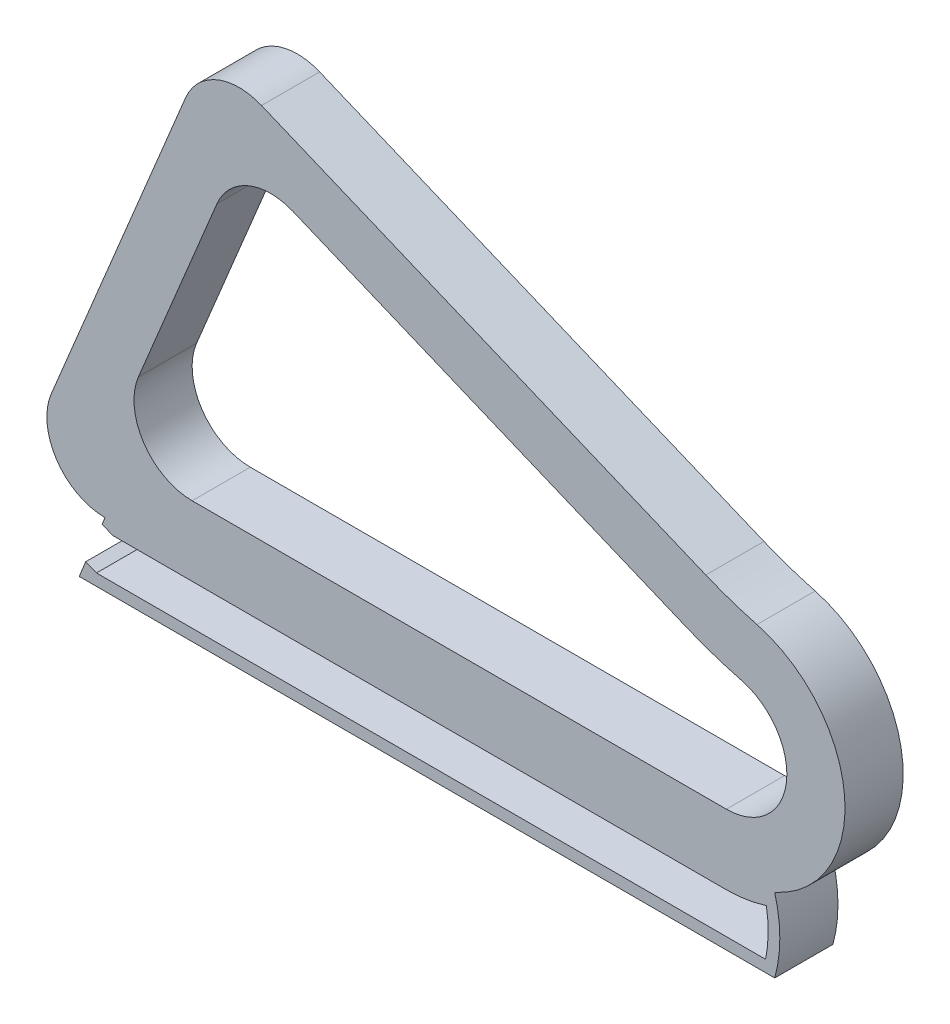
ISO-10303-21;
HEADER;
FILE_DESCRIPTION(('STEP AP214'),'2;1');
FILE_NAME('part.step','',(''),(''),'','','');
FILE_SCHEMA(('AUTOMOTIVE_DESIGN { 1 0 10303 214 1 1 1 1 }'));
ENDSEC;
DATA;
#1=APPLICATION_CONTEXT('core data for automotive mechanical design processes');
#2=APPLICATION_PROTOCOL_DEFINITION('international standard','automotive_design',2000,#1);
#3=PRODUCT_CONTEXT('',#1,'mechanical');
#4=PRODUCT('Part','Part','',(#3));
#5=PRODUCT_RELATED_PRODUCT_CATEGORY('part','',(#4));
#6=PRODUCT_DEFINITION_FORMATION('','',#4);
#7=PRODUCT_DEFINITION_CONTEXT('part definition',#1,'design');
#8=PRODUCT_DEFINITION('design','',#6,#7);
#9=PRODUCT_DEFINITION_SHAPE('','',#8);
#10=(LENGTH_UNIT() NAMED_UNIT(*) SI_UNIT(.MILLI.,.METRE.));
#11=(NAMED_UNIT(*) PLANE_ANGLE_UNIT() SI_UNIT($,.RADIAN.));
#12=(NAMED_UNIT(*) SI_UNIT($,.STERADIAN.) SOLID_ANGLE_UNIT());
#13=UNCERTAINTY_MEASURE_WITH_UNIT(LENGTH_MEASURE(1.E-05),#10,'distance_accuracy_value','');
#14=(GEOMETRIC_REPRESENTATION_CONTEXT(3) GLOBAL_UNCERTAINTY_ASSIGNED_CONTEXT((#13)) GLOBAL_UNIT_ASSIGNED_CONTEXT((#10,
#11,#12)) REPRESENTATION_CONTEXT('',''));
#15=CARTESIAN_POINT('',(0.,0.,0.));
#16=DIRECTION('',(0.,0.,1.));
#17=DIRECTION('',(1.,0.,0.));
#18=AXIS2_PLACEMENT_3D('',#15,#16,#17);
#19=CARTESIAN_POINT('',(-61.1045810015175,-33.881828403146,0.));
#20=DIRECTION('',(-0.927258750185187,0.374421166876292,0.));
#21=DIRECTION('',(-0.374421166876292,-0.927258750185188,0.));
#22=AXIS2_PLACEMENT_3D('',#19,#20,#21);
#23=PLANE('',#22);
#24=DIRECTION('',(0.,0.,1.));
#25=VECTOR('',#24,1.);
#26=CARTESIAN_POINT('',(-61.6097904840369,-35.1329860693935,0.));
#27=LINE('',#26,#25);
#28=CARTESIAN_POINT('',(-61.6097904840369,-35.1329860693935,0.));
#29=VERTEX_POINT('',#28);
#30=CARTESIAN_POINT('',(-61.6097904840369,-35.1329860693935,10.));
#31=VERTEX_POINT('',#30);
#32=EDGE_CURVE('E183',#29,#31,#27,.T.);
#33=ORIENTED_EDGE('',*,*,#32,.T.);
#34=DIRECTION('',(-0.374421166876292,-0.927258750185187,0.));
#35=VECTOR('',#34,1.);
#36=CARTESIAN_POINT('',(-61.1045810015175,-33.881828403146,10.));
#37=LINE('',#36,#35);
#38=CARTESIAN_POINT('',(-61.1045810015175,-33.881828403146,10.));
#39=VERTEX_POINT('',#38);
#40=EDGE_CURVE('E224',#39,#31,#37,.T.);
#41=ORIENTED_EDGE('',*,*,#40,.F.);
#42=DIRECTION('',(0.,0.,-1.));
#43=VECTOR('',#42,1.);
#44=CARTESIAN_POINT('',(-61.1045810015175,-33.881828403146,10.));
#45=LINE('',#44,#43);
#46=CARTESIAN_POINT('',(-61.1045810015175,-33.881828403146,0.));
#47=VERTEX_POINT('',#46);
#48=EDGE_CURVE('E210',#39,#47,#45,.T.);
#49=ORIENTED_EDGE('',*,*,#48,.T.);
#50=DIRECTION('',(-0.374421166876292,-0.927258750185187,0.));
#51=VECTOR('',#50,1.);
#52=CARTESIAN_POINT('',(-61.1045810015175,-33.881828403146,0.));
#53=LINE('',#52,#51);
#54=EDGE_CURVE('E202',#47,#29,#53,.T.);
#55=ORIENTED_EDGE('',*,*,#54,.T.);
#56=EDGE_LOOP('',(#33,#41,#49,#55));
#57=FACE_BOUND('',#56,.T.);
#58=ADVANCED_FACE('F32',(#57),#23,.T.);
#59=CARTESIAN_POINT('',(45.7315868313186,-13.4753335774168,10.));
#60=DIRECTION('',(0.,0.,1.));
#61=DIRECTION('',(1.,0.,0.));
#62=AXIS2_PLACEMENT_3D('',#59,#60,#61);
#63=PLANE('',#62);
#64=DIRECTION('',(0.927258750185187,-0.374421166876292,0.));
#65=VECTOR('',#64,1.);
#66=CARTESIAN_POINT('',(-96.4514029414184,-21.0641652687928,10.));
#67=LINE('',#66,#65);
#68=CARTESIAN_POINT('',(-59.7552729836665,-35.881828403146,10.));
#69=VERTEX_POINT('',#68);
#70=EDGE_CURVE('E189',#31,#69,#67,.T.);
#71=ORIENTED_EDGE('',*,*,#70,.T.);
#72=DIRECTION('',(-1.,0.,0.));
#73=VECTOR('',#72,1.);
#74=CARTESIAN_POINT('',(-59.7552729836665,-35.881828403146,10.));
#75=LINE('',#74,#73);
#76=CARTESIAN_POINT('',(45.7315868313188,-35.881828403146,10.));
#77=VERTEX_POINT('',#76);
#78=EDGE_CURVE('E435',#77,#69,#75,.T.);
#79=ORIENTED_EDGE('',*,*,#78,.F.);
#80=CARTESIAN_POINT('',(45.7315868313186,-13.4753335774168,10.));
#81=DIRECTION('',(0.,0.,-1.));
#82=DIRECTION('',(1.,0.,0.));
#83=AXIS2_PLACEMENT_3D('',#80,#81,#82);
#84=CIRCLE('',#83,22.4064948257292);
#85=CARTESIAN_POINT('',(52.610255817661,-34.7998481874088,10.));
#86=VERTEX_POINT('',#85);
#87=EDGE_CURVE('E434',#86,#77,#84,.T.);
#88=ORIENTED_EDGE('',*,*,#87,.F.);
#89=CARTESIAN_POINT('',(31.2661836864261,-38.4855044203721,10.));
#90=DIRECTION('',(0.,0.,1.));
#91=DIRECTION('',(1.,0.,0.));
#92=AXIS2_PLACEMENT_3D('',#89,#90,#91);
#93=CIRCLE('',#92,21.6599509928102);
#94=CARTESIAN_POINT('',(52.4794000096137,-42.8619105071728,10.));
#95=VERTEX_POINT('',#94);
#96=EDGE_CURVE('E205',#95,#86,#93,.T.);
#97=ORIENTED_EDGE('',*,*,#96,.F.);
#98=DIRECTION('',(1.,0.,0.));
#99=VECTOR('',#98,1.);
#100=CARTESIAN_POINT('',(41.2978997370033,-42.8619105071728,10.));
#101=LINE('',#100,#99);
#102=CARTESIAN_POINT('',(-62.5737856003014,-42.8619105071728,10.));
#103=VERTEX_POINT('',#102);
#104=EDGE_CURVE('E414',#103,#95,#101,.T.);
#105=ORIENTED_EDGE('',*,*,#104,.F.);
#106=DIRECTION('',(0.927258750185187,-0.374421166876292,0.));
#107=VECTOR('',#106,1.);
#108=CARTESIAN_POINT('',(-99.2699155580533,-28.0442473728195,10.));
#109=LINE('',#108,#107);
#110=CARTESIAN_POINT('',(-64.4283031006717,-42.1130681734202,10.));
#111=VERTEX_POINT('',#110);
#112=EDGE_CURVE('E403',#111,#103,#109,.T.);
#113=ORIENTED_EDGE('',*,*,#112,.F.);
#114=CARTESIAN_POINT('',(-65.538268095833,-44.8619105071728,10.));
#115=VERTEX_POINT('',#114);
#116=EDGE_CURVE('E227',#111,#115,#37,.T.);
#117=ORIENTED_EDGE('',*,*,#116,.T.);
#118=DIRECTION('',(1.,0.,0.));
#119=VECTOR('',#118,1.);
#120=CARTESIAN_POINT('',(41.2978997370033,-44.8619105071728,10.));
#121=LINE('',#120,#119);
#122=CARTESIAN_POINT('',(54.0507119106047,-44.8619105071728,10.));
#123=VERTEX_POINT('',#122);
#124=EDGE_CURVE('E226',#115,#123,#121,.T.);
#125=ORIENTED_EDGE('',*,*,#124,.T.);
#126=CARTESIAN_POINT('',(31.2661836864261,-38.4855044203721,10.));
#127=DIRECTION('',(0.,0.,1.));
#128=DIRECTION('',(1.,0.,0.));
#129=AXIS2_PLACEMENT_3D('',#126,#127,#128);
#130=CIRCLE('',#129,23.6599509928102);
#131=CARTESIAN_POINT('',(54.0507119106047,-32.1090983335713,10.));
#132=VERTEX_POINT('',#131);
#133=EDGE_CURVE('E216',#123,#132,#130,.T.);
#134=ORIENTED_EDGE('',*,*,#133,.T.);
#135=CARTESIAN_POINT('',(45.7315868313186,-13.4753335774168,10.));
#136=DIRECTION('',(0.,0.,1.));
#137=DIRECTION('',(1.,0.,0.));
#138=AXIS2_PLACEMENT_3D('',#135,#136,#137);
#139=CIRCLE('',#138,20.4064948257292);
#140=CARTESIAN_POINT('',(50.9926260027199,6.24132176545248,10.));
#141=VERTEX_POINT('',#140);
#142=EDGE_CURVE('E47',#132,#141,#139,.T.);
#143=ORIENTED_EDGE('',*,*,#142,.T.);
#144=CARTESIAN_POINT('',(69.0394657536485,73.874978882337,10.));
#145=DIRECTION('',(0.,0.,1.));
#146=DIRECTION('',(1.,0.,0.));
#147=AXIS2_PLACEMENT_3D('',#144,#145,#146);
#148=CIRCLE('',#147,70.);
#149=CARTESIAN_POINT('',(42.1998756582728,9.22487135332969,10.));
#150=VERTEX_POINT('',#149);
#151=EDGE_CURVE('E316',#141,#150,#148,.F.);
#152=ORIENTED_EDGE('',*,*,#151,.T.);
#153=DIRECTION('',(-0.923572964700104,0.383422715648225,0.));
#154=VECTOR('',#153,1.);
#155=CARTESIAN_POINT('',(48.0405297195748,6.8001149703043,10.));
#156=LINE('',#155,#154);
#157=CARTESIAN_POINT('',(-34.1937785119713,40.9398126300674,10.));
#158=VERTEX_POINT('',#157);
#159=EDGE_CURVE('E263',#150,#158,#156,.T.);
#160=ORIENTED_EDGE('',*,*,#159,.T.);
#161=CARTESIAN_POINT('',(-38.0280056684536,31.7040829830663,10.));
#162=DIRECTION('',(0.,0.,1.));
#163=DIRECTION('',(1.,0.,0.));
#164=AXIS2_PLACEMENT_3D('',#161,#162,#163);
#165=CIRCLE('',#164,10.);
#166=CARTESIAN_POINT('',(-47.2637353154547,35.5383101395486,10.));
#167=VERTEX_POINT('',#166);
#168=EDGE_CURVE('E301',#158,#167,#165,.T.);
#169=ORIENTED_EDGE('',*,*,#168,.T.);
#170=DIRECTION('',(-0.383422715648225,-0.923572964700104,0.));
#171=VECTOR('',#170,1.);
#172=CARTESIAN_POINT('',(-43.4295081589724,44.7740397865496,10.));
#173=LINE('',#172,#171);
#174=CARTESIAN_POINT('',(-70.3403106485186,-20.0476012466638,10.));
#175=VERTEX_POINT('',#174);
#176=EDGE_CURVE('E259',#167,#175,#173,.T.);
#177=ORIENTED_EDGE('',*,*,#176,.T.);
#178=CARTESIAN_POINT('',(-61.1045810015175,-23.881828403146,10.));
#179=DIRECTION('',(0.,0.,1.));
#180=DIRECTION('',(1.,0.,0.));
#181=AXIS2_PLACEMENT_3D('',#178,#179,#180);
#182=CIRCLE('',#181,10.);
#183=EDGE_CURVE('E275',#175,#39,#182,.T.);
#184=ORIENTED_EDGE('',*,*,#183,.T.);
#185=ORIENTED_EDGE('',*,*,#40,.T.);
#186=EDGE_LOOP('',(#71,#79,#88,#97,#105,#113,#117,#125,#134,#143,#152,#160,#169,#177,#184,#185));
#187=FACE_BOUND('',#186,.T.);
#188=DIRECTION('',(-0.923572964700104,0.383422715648225,0.));
#189=VECTOR('',#188,1.);
#190=CARTESIAN_POINT('',(45.7315868313186,-3.06883875168755,10.));
#191=LINE('',#190,#189);
#192=CARTESIAN_POINT('',(38.9976061815971,-0.273216481954694,10.));
#193=VERTEX_POINT('',#192);
#194=CARTESIAN_POINT('',(-28.7922760214525,27.8698558265841,10.));
#195=VERTEX_POINT('',#194);
#196=EDGE_CURVE('E241',#193,#195,#191,.T.);
#197=ORIENTED_EDGE('',*,*,#196,.F.);
#198=CARTESIAN_POINT('',(65.8371962769728,64.3768910470526,10.));
#199=DIRECTION('',(0.,0.,1.));
#200=DIRECTION('',(1.,0.,0.));
#201=AXIS2_PLACEMENT_3D('',#198,#199,#200);
#202=CIRCLE('',#201,70.);
#203=CARTESIAN_POINT('',(48.3337263863111,-3.39942149491664,10.));
#204=VERTEX_POINT('',#203);
#205=EDGE_CURVE('E11',#193,#204,#202,.T.);
#206=ORIENTED_EDGE('',*,*,#205,.T.);
#207=CARTESIAN_POINT('',(45.7315868313186,-13.4753335774168,10.));
#208=DIRECTION('',(0.,0.,1.));
#209=DIRECTION('',(1.,0.,0.));
#210=AXIS2_PLACEMENT_3D('',#207,#208,#209);
#211=CIRCLE('',#210,10.4064948257292);
#212=CARTESIAN_POINT('',(45.7315868313186,-23.881828403146,10.));
#213=VERTEX_POINT('',#212);
#214=EDGE_CURVE('E238',#213,#204,#211,.T.);
#215=ORIENTED_EDGE('',*,*,#214,.F.);
#216=DIRECTION('',(1.,0.,0.));
#217=VECTOR('',#216,1.);
#218=CARTESIAN_POINT('',(-61.1045810015175,-23.881828403146,10.));
#219=LINE('',#218,#217);
#220=CARTESIAN_POINT('',(-46.1255509895527,-23.881828403146,10.));
#221=VERTEX_POINT('',#220);
#222=EDGE_CURVE('E246',#221,#213,#219,.T.);
#223=ORIENTED_EDGE('',*,*,#222,.F.);
#224=CARTESIAN_POINT('',(-46.1255509895527,-13.881828403146,10.));
#225=DIRECTION('',(0.,0.,1.));
#226=DIRECTION('',(1.,0.,0.));
#227=AXIS2_PLACEMENT_3D('',#224,#225,#226);
#228=CIRCLE('',#227,10.);
#229=CARTESIAN_POINT('',(-55.3612806365537,-10.0476012466638,10.));
#230=VERTEX_POINT('',#229);
#231=EDGE_CURVE('E284',#221,#230,#228,.F.);
#232=ORIENTED_EDGE('',*,*,#231,.T.);
#233=DIRECTION('',(-0.383422715648225,-0.923572964700104,0.));
#234=VECTOR('',#233,1.);
#235=CARTESIAN_POINT('',(-38.0280056684536,31.7040829830664,10.));
#236=LINE('',#235,#234);
#237=CARTESIAN_POINT('',(-41.8622328249359,22.4683533360653,10.));
#238=VERTEX_POINT('',#237);
#239=EDGE_CURVE('E244',#238,#230,#236,.T.);
#240=ORIENTED_EDGE('',*,*,#239,.F.);
#241=CARTESIAN_POINT('',(-32.6265031779348,18.6341261795831,10.));
#242=DIRECTION('',(0.,0.,1.));
#243=DIRECTION('',(1.,0.,0.));
#244=AXIS2_PLACEMENT_3D('',#241,#242,#243);
#245=CIRCLE('',#244,10.);
#246=EDGE_CURVE('E305',#238,#195,#245,.F.);
#247=ORIENTED_EDGE('',*,*,#246,.T.);
#248=EDGE_LOOP('',(#197,#206,#215,#223,#232,#240,#247));
#249=FACE_BOUND('',#248,.T.);
#250=ADVANCED_FACE('F330',(#187,#249),#63,.T.);
#251=CARTESIAN_POINT('',(45.7315868313186,-13.4753335774168,0.));
#252=DIRECTION('',(0.,0.,1.));
#253=DIRECTION('',(1.,0.,0.));
#254=AXIS2_PLACEMENT_3D('',#251,#252,#253);
#255=PLANE('',#254);
#256=DIRECTION('',(-1.,0.,0.));
#257=VECTOR('',#256,1.);
#258=CARTESIAN_POINT('',(-59.7552729836665,-35.881828403146,0.));
#259=LINE('',#258,#257);
#260=CARTESIAN_POINT('',(45.7315868313188,-35.881828403146,0.));
#261=VERTEX_POINT('',#260);
#262=CARTESIAN_POINT('',(-59.7552729836665,-35.881828403146,0.));
#263=VERTEX_POINT('',#262);
#264=EDGE_CURVE('E204',#261,#263,#259,.T.);
#265=ORIENTED_EDGE('',*,*,#264,.T.);
#266=DIRECTION('',(0.927258750185187,-0.374421166876292,0.));
#267=VECTOR('',#266,1.);
#268=CARTESIAN_POINT('',(-96.4514029414184,-21.0641652687928,0.));
#269=LINE('',#268,#267);
#270=EDGE_CURVE('E186',#29,#263,#269,.T.);
#271=ORIENTED_EDGE('',*,*,#270,.F.);
#272=ORIENTED_EDGE('',*,*,#54,.F.);
#273=CARTESIAN_POINT('',(-61.1045810015175,-23.881828403146,0.));
#274=DIRECTION('',(0.,0.,1.));
#275=DIRECTION('',(1.,0.,0.));
#276=AXIS2_PLACEMENT_3D('',#273,#274,#275);
#277=CIRCLE('',#276,10.);
#278=CARTESIAN_POINT('',(-70.3403106485186,-20.0476012466638,0.));
#279=VERTEX_POINT('',#278);
#280=EDGE_CURVE('E270',#47,#279,#277,.F.);
#281=ORIENTED_EDGE('',*,*,#280,.T.);
#282=DIRECTION('',(-0.383422715648225,-0.923572964700104,0.));
#283=VECTOR('',#282,1.);
#284=CARTESIAN_POINT('',(-43.4295081589724,44.7740397865496,0.));
#285=LINE('',#284,#283);
#286=CARTESIAN_POINT('',(-47.2637353154547,35.5383101395486,0.));
#287=VERTEX_POINT('',#286);
#288=EDGE_CURVE('E258',#287,#279,#285,.T.);
#289=ORIENTED_EDGE('',*,*,#288,.F.);
#290=CARTESIAN_POINT('',(-38.0280056684536,31.7040829830663,0.));
#291=DIRECTION('',(0.,0.,1.));
#292=DIRECTION('',(1.,0.,0.));
#293=AXIS2_PLACEMENT_3D('',#290,#291,#292);
#294=CIRCLE('',#293,10.);
#295=CARTESIAN_POINT('',(-34.1937785119713,40.9398126300674,0.));
#296=VERTEX_POINT('',#295);
#297=EDGE_CURVE('E295',#287,#296,#294,.F.);
#298=ORIENTED_EDGE('',*,*,#297,.T.);
#299=DIRECTION('',(-0.923572964700104,0.383422715648225,0.));
#300=VECTOR('',#299,1.);
#301=CARTESIAN_POINT('',(48.0405297195748,6.8001149703043,0.));
#302=LINE('',#301,#300);
#303=CARTESIAN_POINT('',(42.1998756582728,9.22487135332969,0.));
#304=VERTEX_POINT('',#303);
#305=EDGE_CURVE('E261',#304,#296,#302,.T.);
#306=ORIENTED_EDGE('',*,*,#305,.F.);
#307=CARTESIAN_POINT('',(69.0394657536485,73.874978882337,0.));
#308=DIRECTION('',(0.,0.,1.));
#309=DIRECTION('',(1.,0.,0.));
#310=AXIS2_PLACEMENT_3D('',#307,#308,#309);
#311=CIRCLE('',#310,70.);
#312=CARTESIAN_POINT('',(50.9926260027199,6.24132176545248,0.));
#313=VERTEX_POINT('',#312);
#314=EDGE_CURVE('E313',#304,#313,#311,.T.);
#315=ORIENTED_EDGE('',*,*,#314,.T.);
#316=CARTESIAN_POINT('',(45.7315868313186,-13.4753335774168,0.));
#317=DIRECTION('',(0.,0.,1.));
#318=DIRECTION('',(1.,0.,0.));
#319=AXIS2_PLACEMENT_3D('',#316,#317,#318);
#320=CIRCLE('',#319,20.4064948257292);
#321=CARTESIAN_POINT('',(54.0507119106047,-32.1090983335713,0.));
#322=VERTEX_POINT('',#321);
#323=EDGE_CURVE('E266',#322,#313,#320,.T.);
#324=ORIENTED_EDGE('',*,*,#323,.F.);
#325=CARTESIAN_POINT('',(31.2661836864261,-38.4855044203721,0.));
#326=DIRECTION('',(0.,0.,1.));
#327=DIRECTION('',(1.,0.,0.));
#328=AXIS2_PLACEMENT_3D('',#325,#326,#327);
#329=CIRCLE('',#328,23.6599509928102);
#330=CARTESIAN_POINT('',(54.0507119106047,-44.8619105071728,0.));
#331=VERTEX_POINT('',#330);
#332=EDGE_CURVE('E214',#331,#322,#329,.T.);
#333=ORIENTED_EDGE('',*,*,#332,.F.);
#334=DIRECTION('',(1.,0.,0.));
#335=VECTOR('',#334,1.);
#336=CARTESIAN_POINT('',(-65.538268095833,-44.8619105071728,0.));
#337=LINE('',#336,#335);
#338=CARTESIAN_POINT('',(-65.538268095833,-44.8619105071728,0.));
#339=VERTEX_POINT('',#338);
#340=EDGE_CURVE('E211',#339,#331,#337,.T.);
#341=ORIENTED_EDGE('',*,*,#340,.F.);
#342=CARTESIAN_POINT('',(-64.4283031006717,-42.1130681734202,0.));
#343=VERTEX_POINT('',#342);
#344=EDGE_CURVE('E212',#343,#339,#53,.T.);
#345=ORIENTED_EDGE('',*,*,#344,.F.);
#346=DIRECTION('',(0.927258750185187,-0.374421166876292,0.));
#347=VECTOR('',#346,1.);
#348=CARTESIAN_POINT('',(-99.2699155580533,-28.0442473728195,0.));
#349=LINE('',#348,#347);
#350=CARTESIAN_POINT('',(-62.5737856003014,-42.8619105071728,0.));
#351=VERTEX_POINT('',#350);
#352=EDGE_CURVE('E206',#343,#351,#349,.T.);
#353=ORIENTED_EDGE('',*,*,#352,.T.);
#354=DIRECTION('',(1.,0.,0.));
#355=VECTOR('',#354,1.);
#356=CARTESIAN_POINT('',(-62.5737856003014,-42.8619105071728,0.));
#357=LINE('',#356,#355);
#358=CARTESIAN_POINT('',(52.4794000096137,-42.8619105071728,0.));
#359=VERTEX_POINT('',#358);
#360=EDGE_CURVE('E423',#351,#359,#357,.T.);
#361=ORIENTED_EDGE('',*,*,#360,.T.);
#362=CARTESIAN_POINT('',(31.2661836864261,-38.4855044203721,0.));
#363=DIRECTION('',(0.,0.,1.));
#364=DIRECTION('',(1.,0.,0.));
#365=AXIS2_PLACEMENT_3D('',#362,#363,#364);
#366=CIRCLE('',#365,21.6599509928102);
#367=CARTESIAN_POINT('',(52.610255817661,-34.7998481874088,0.));
#368=VERTEX_POINT('',#367);
#369=EDGE_CURVE('E437',#359,#368,#366,.T.);
#370=ORIENTED_EDGE('',*,*,#369,.T.);
#371=CARTESIAN_POINT('',(45.7315868313186,-13.4753335774168,0.));
#372=DIRECTION('',(0.,0.,-1.));
#373=DIRECTION('',(1.,0.,0.));
#374=AXIS2_PLACEMENT_3D('',#371,#372,#373);
#375=CIRCLE('',#374,22.4064948257292);
#376=EDGE_CURVE('E429',#368,#261,#375,.T.);
#377=ORIENTED_EDGE('',*,*,#376,.T.);
#378=EDGE_LOOP('',(#265,#271,#272,#281,#289,#298,#306,#315,#324,#333,#341,#345,#353,#361,#370,#377));
#379=FACE_BOUND('',#378,.T.);
#380=CARTESIAN_POINT('',(45.7315868313186,-13.4753335774168,0.));
#381=DIRECTION('',(0.,0.,1.));
#382=DIRECTION('',(1.,0.,0.));
#383=AXIS2_PLACEMENT_3D('',#380,#381,#382);
#384=CIRCLE('',#383,10.4064948257292);
#385=CARTESIAN_POINT('',(45.7315868313186,-23.881828403146,0.));
#386=VERTEX_POINT('',#385);
#387=CARTESIAN_POINT('',(48.3337263863111,-3.39942149491664,0.));
#388=VERTEX_POINT('',#387);
#389=EDGE_CURVE('E233',#386,#388,#384,.T.);
#390=ORIENTED_EDGE('',*,*,#389,.T.);
#391=CARTESIAN_POINT('',(65.8371962769728,64.3768910470526,0.));
#392=DIRECTION('',(0.,0.,1.));
#393=DIRECTION('',(1.,0.,0.));
#394=AXIS2_PLACEMENT_3D('',#391,#392,#393);
#395=CIRCLE('',#394,70.);
#396=CARTESIAN_POINT('',(38.9976061815971,-0.273216481954694,0.));
#397=VERTEX_POINT('',#396);
#398=EDGE_CURVE('E321',#388,#397,#395,.F.);
#399=ORIENTED_EDGE('',*,*,#398,.T.);
#400=DIRECTION('',(-0.923572964700104,0.383422715648225,0.));
#401=VECTOR('',#400,1.);
#402=CARTESIAN_POINT('',(45.7315868313186,-3.06883875168755,0.));
#403=LINE('',#402,#401);
#404=CARTESIAN_POINT('',(-28.7922760214525,27.8698558265841,0.));
#405=VERTEX_POINT('',#404);
#406=EDGE_CURVE('E251',#397,#405,#403,.T.);
#407=ORIENTED_EDGE('',*,*,#406,.T.);
#408=CARTESIAN_POINT('',(-32.6265031779348,18.6341261795831,0.));
#409=DIRECTION('',(0.,0.,1.));
#410=DIRECTION('',(1.,0.,0.));
#411=AXIS2_PLACEMENT_3D('',#408,#409,#410);
#412=CIRCLE('',#411,10.);
#413=CARTESIAN_POINT('',(-41.8622328249359,22.4683533360653,0.));
#414=VERTEX_POINT('',#413);
#415=EDGE_CURVE('E303',#405,#414,#412,.T.);
#416=ORIENTED_EDGE('',*,*,#415,.T.);
#417=DIRECTION('',(-0.383422715648225,-0.923572964700104,0.));
#418=VECTOR('',#417,1.);
#419=CARTESIAN_POINT('',(-38.0280056684536,31.7040829830664,0.));
#420=LINE('',#419,#418);
#421=CARTESIAN_POINT('',(-55.3612806365537,-10.0476012466638,0.));
#422=VERTEX_POINT('',#421);
#423=EDGE_CURVE('E253',#414,#422,#420,.T.);
#424=ORIENTED_EDGE('',*,*,#423,.T.);
#425=CARTESIAN_POINT('',(-46.1255509895527,-13.881828403146,0.));
#426=DIRECTION('',(0.,0.,1.));
#427=DIRECTION('',(1.,0.,0.));
#428=AXIS2_PLACEMENT_3D('',#425,#426,#427);
#429=CIRCLE('',#428,10.);
#430=CARTESIAN_POINT('',(-46.1255509895527,-23.881828403146,0.));
#431=VERTEX_POINT('',#430);
#432=EDGE_CURVE('E282',#422,#431,#429,.T.);
#433=ORIENTED_EDGE('',*,*,#432,.T.);
#434=DIRECTION('',(1.,0.,0.));
#435=VECTOR('',#434,1.);
#436=CARTESIAN_POINT('',(-61.1045810015175,-23.881828403146,0.));
#437=LINE('',#436,#435);
#438=EDGE_CURVE('E242',#431,#386,#437,.T.);
#439=ORIENTED_EDGE('',*,*,#438,.T.);
#440=EDGE_LOOP('',(#390,#399,#407,#416,#424,#433,#439));
#441=FACE_BOUND('',#440,.T.);
#442=ADVANCED_FACE('F199',(#379,#441),#255,.F.);
#443=CARTESIAN_POINT('',(-43.4295081589724,44.7740397865496,10.));
#444=DIRECTION('',(0.923572964700104,-0.383422715648225,0.));
#445=DIRECTION('',(0.383422715648225,0.923572964700104,0.));
#446=AXIS2_PLACEMENT_3D('',#443,#444,#445);
#447=PLANE('',#446);
#448=ORIENTED_EDGE('',*,*,#176,.F.);
#449=DIRECTION('',(0.,0.,-1.));
#450=VECTOR('',#449,1.);
#451=CARTESIAN_POINT('',(-47.2637353154547,35.5383101395486,10.));
#452=LINE('',#451,#450);
#453=EDGE_CURVE('E292',#167,#287,#452,.T.);
#454=ORIENTED_EDGE('',*,*,#453,.T.);
#455=ORIENTED_EDGE('',*,*,#288,.T.);
#456=DIRECTION('',(0.,0.,-1.));
#457=VECTOR('',#456,1.);
#458=CARTESIAN_POINT('',(-70.3403106485186,-20.0476012466638,10.));
#459=LINE('',#458,#457);
#460=EDGE_CURVE('E272',#279,#175,#459,.F.);
#461=ORIENTED_EDGE('',*,*,#460,.T.);
#462=EDGE_LOOP('',(#448,#454,#455,#461));
#463=FACE_BOUND('',#462,.T.);
#464=ADVANCED_FACE('F456',(#463),#447,.F.);
#465=CARTESIAN_POINT('',(45.7315868313186,-13.4753335774168,10.));
#466=DIRECTION('',(0.,0.,-1.));
#467=DIRECTION('',(-1.,0.,0.));
#468=AXIS2_PLACEMENT_3D('',#465,#466,#467);
#469=CYLINDRICAL_SURFACE('',#468,20.4064948257292);
#470=ORIENTED_EDGE('',*,*,#142,.F.);
#471=DIRECTION('',(0.,0.,1.));
#472=VECTOR('',#471,1.);
#473=CARTESIAN_POINT('',(54.0507119106047,-32.1090983335713,0.));
#474=LINE('',#473,#472);
#475=EDGE_CURVE('E51',#322,#132,#474,.T.);
#476=ORIENTED_EDGE('',*,*,#475,.F.);
#477=ORIENTED_EDGE('',*,*,#323,.T.);
#478=DIRECTION('',(0.,0.,-1.));
#479=VECTOR('',#478,1.);
#480=CARTESIAN_POINT('',(50.9926260027199,6.24132176545249,10.));
#481=LINE('',#480,#479);
#482=EDGE_CURVE('E311',#313,#141,#481,.F.);
#483=ORIENTED_EDGE('',*,*,#482,.T.);
#484=EDGE_LOOP('',(#470,#476,#477,#483));
#485=FACE_BOUND('',#484,.T.);
#486=ADVANCED_FACE('F468',(#485),#469,.T.);
#487=CARTESIAN_POINT('',(48.0405297195748,6.8001149703043,10.));
#488=DIRECTION('',(-0.383422715648225,-0.923572964700104,0.));
#489=DIRECTION('',(0.923572964700104,-0.383422715648225,0.));
#490=AXIS2_PLACEMENT_3D('',#487,#488,#489);
#491=PLANE('',#490);
#492=ORIENTED_EDGE('',*,*,#159,.F.);
#493=DIRECTION('',(0.,0.,1.));
#494=VECTOR('',#493,1.);
#495=CARTESIAN_POINT('',(42.1998756582728,9.22487135332969,0.));
#496=LINE('',#495,#494);
#497=EDGE_CURVE('E308',#150,#304,#496,.F.);
#498=ORIENTED_EDGE('',*,*,#497,.T.);
#499=ORIENTED_EDGE('',*,*,#305,.T.);
#500=DIRECTION('',(0.,0.,-1.));
#501=VECTOR('',#500,1.);
#502=CARTESIAN_POINT('',(-34.1937785119714,40.9398126300674,10.));
#503=LINE('',#502,#501);
#504=EDGE_CURVE('E298',#296,#158,#503,.F.);
#505=ORIENTED_EDGE('',*,*,#504,.T.);
#506=EDGE_LOOP('',(#492,#498,#499,#505));
#507=FACE_BOUND('',#506,.T.);
#508=ADVANCED_FACE('F463',(#507),#491,.F.);
#509=CARTESIAN_POINT('',(45.7315868313186,-13.4753335774168,10.));
#510=DIRECTION('',(0.,0.,-1.));
#511=DIRECTION('',(-1.,0.,0.));
#512=AXIS2_PLACEMENT_3D('',#509,#510,#511);
#513=CYLINDRICAL_SURFACE('',#512,10.4064948257292);
#514=ORIENTED_EDGE('',*,*,#214,.T.);
#515=DIRECTION('',(0.,0.,-1.));
#516=VECTOR('',#515,1.);
#517=CARTESIAN_POINT('',(48.3337263863111,-3.39942149491664,10.));
#518=LINE('',#517,#516);
#519=EDGE_CURVE('E318',#204,#388,#518,.T.);
#520=ORIENTED_EDGE('',*,*,#519,.T.);
#521=ORIENTED_EDGE('',*,*,#389,.F.);
#522=DIRECTION('',(0.,0.,-1.));
#523=VECTOR('',#522,1.);
#524=CARTESIAN_POINT('',(45.7315868313186,-23.881828403146,10.));
#525=LINE('',#524,#523);
#526=EDGE_CURVE('E248',#213,#386,#525,.T.);
#527=ORIENTED_EDGE('',*,*,#526,.F.);
#528=EDGE_LOOP('',(#514,#520,#521,#527));
#529=FACE_BOUND('',#528,.T.);
#530=ADVANCED_FACE('F338',(#529),#513,.F.);
#531=CARTESIAN_POINT('',(45.7315868313186,-3.06883875168755,10.));
#532=DIRECTION('',(-0.383422715648225,-0.923572964700104,0.));
#533=DIRECTION('',(0.923572964700104,-0.383422715648225,0.));
#534=AXIS2_PLACEMENT_3D('',#531,#532,#533);
#535=PLANE('',#534);
#536=ORIENTED_EDGE('',*,*,#406,.F.);
#537=DIRECTION('',(0.,0.,-1.));
#538=VECTOR('',#537,1.);
#539=CARTESIAN_POINT('',(38.9976061815971,-0.273216481954693,10.));
#540=LINE('',#539,#538);
#541=EDGE_CURVE('E40',#397,#193,#540,.F.);
#542=ORIENTED_EDGE('',*,*,#541,.T.);
#543=ORIENTED_EDGE('',*,*,#196,.T.);
#544=DIRECTION('',(0.,0.,-1.));
#545=VECTOR('',#544,1.);
#546=CARTESIAN_POINT('',(-28.7922760214526,27.8698558265841,0.));
#547=LINE('',#546,#545);
#548=EDGE_CURVE('E287',#195,#405,#547,.T.);
#549=ORIENTED_EDGE('',*,*,#548,.T.);
#550=EDGE_LOOP('',(#536,#542,#543,#549));
#551=FACE_BOUND('',#550,.T.);
#552=ADVANCED_FACE('F326',(#551),#535,.T.);
#553=CARTESIAN_POINT('',(-38.0280056684536,31.7040829830664,10.));
#554=DIRECTION('',(0.923572964700104,-0.383422715648225,0.));
#555=DIRECTION('',(0.383422715648225,0.923572964700104,0.));
#556=AXIS2_PLACEMENT_3D('',#553,#554,#555);
#557=PLANE('',#556);
#558=ORIENTED_EDGE('',*,*,#423,.F.);
#559=DIRECTION('',(0.,0.,-1.));
#560=VECTOR('',#559,1.);
#561=CARTESIAN_POINT('',(-41.8622328249359,22.4683533360653,10.));
#562=LINE('',#561,#560);
#563=EDGE_CURVE('E290',#414,#238,#562,.F.);
#564=ORIENTED_EDGE('',*,*,#563,.T.);
#565=ORIENTED_EDGE('',*,*,#239,.T.);
#566=DIRECTION('',(0.,0.,-1.));
#567=VECTOR('',#566,1.);
#568=CARTESIAN_POINT('',(-55.3612806365537,-10.0476012466638,0.));
#569=LINE('',#568,#567);
#570=EDGE_CURVE('E277',#230,#422,#569,.T.);
#571=ORIENTED_EDGE('',*,*,#570,.T.);
#572=EDGE_LOOP('',(#558,#564,#565,#571));
#573=FACE_BOUND('',#572,.T.);
#574=ADVANCED_FACE('F356',(#573),#557,.T.);
#575=CARTESIAN_POINT('',(-61.1045810015175,-23.881828403146,10.));
#576=DIRECTION('',(0.,1.,0.));
#577=DIRECTION('',(0.,0.,1.));
#578=AXIS2_PLACEMENT_3D('',#575,#576,#577);
#579=PLANE('',#578);
#580=ORIENTED_EDGE('',*,*,#438,.F.);
#581=DIRECTION('',(0.,0.,-1.));
#582=VECTOR('',#581,1.);
#583=CARTESIAN_POINT('',(-46.1255509895527,-23.881828403146,10.));
#584=LINE('',#583,#582);
#585=EDGE_CURVE('E280',#431,#221,#584,.F.);
#586=ORIENTED_EDGE('',*,*,#585,.T.);
#587=ORIENTED_EDGE('',*,*,#222,.T.);
#588=ORIENTED_EDGE('',*,*,#526,.T.);
#589=EDGE_LOOP('',(#580,#586,#587,#588));
#590=FACE_BOUND('',#589,.T.);
#591=ADVANCED_FACE('F344',(#590),#579,.T.);
#592=CARTESIAN_POINT('',(-61.1045810015175,-23.881828403146,10.));
#593=DIRECTION('',(0.,0.,-1.));
#594=DIRECTION('',(-1.,0.,0.));
#595=AXIS2_PLACEMENT_3D('',#592,#593,#594);
#596=CYLINDRICAL_SURFACE('',#595,10.);
#597=ORIENTED_EDGE('',*,*,#183,.F.);
#598=ORIENTED_EDGE('',*,*,#460,.F.);
#599=ORIENTED_EDGE('',*,*,#280,.F.);
#600=ORIENTED_EDGE('',*,*,#48,.F.);
#601=EDGE_LOOP('',(#597,#598,#599,#600));
#602=FACE_BOUND('',#601,.T.);
#603=ADVANCED_FACE('F363',(#602),#596,.T.);
#604=CARTESIAN_POINT('',(-46.1255509895527,-13.881828403146,10.));
#605=DIRECTION('',(0.,0.,1.));
#606=DIRECTION('',(1.,0.,0.));
#607=AXIS2_PLACEMENT_3D('',#604,#605,#606);
#608=CYLINDRICAL_SURFACE('',#607,10.);
#609=ORIENTED_EDGE('',*,*,#231,.F.);
#610=ORIENTED_EDGE('',*,*,#585,.F.);
#611=ORIENTED_EDGE('',*,*,#432,.F.);
#612=ORIENTED_EDGE('',*,*,#570,.F.);
#613=EDGE_LOOP('',(#609,#610,#611,#612));
#614=FACE_BOUND('',#613,.T.);
#615=ADVANCED_FACE('F348',(#614),#608,.F.);
#616=CARTESIAN_POINT('',(-32.6265031779348,18.6341261795831,10.));
#617=DIRECTION('',(0.,0.,1.));
#618=DIRECTION('',(1.,0.,0.));
#619=AXIS2_PLACEMENT_3D('',#616,#617,#618);
#620=CYLINDRICAL_SURFACE('',#619,10.);
#621=ORIENTED_EDGE('',*,*,#246,.F.);
#622=ORIENTED_EDGE('',*,*,#563,.F.);
#623=ORIENTED_EDGE('',*,*,#415,.F.);
#624=ORIENTED_EDGE('',*,*,#548,.F.);
#625=EDGE_LOOP('',(#621,#622,#623,#624));
#626=FACE_BOUND('',#625,.T.);
#627=ADVANCED_FACE('F353',(#626),#620,.F.);
#628=CARTESIAN_POINT('',(-38.0280056684536,31.7040829830663,10.));
#629=DIRECTION('',(0.,0.,-1.));
#630=DIRECTION('',(-1.,0.,0.));
#631=AXIS2_PLACEMENT_3D('',#628,#629,#630);
#632=CYLINDRICAL_SURFACE('',#631,10.);
#633=ORIENTED_EDGE('',*,*,#168,.F.);
#634=ORIENTED_EDGE('',*,*,#504,.F.);
#635=ORIENTED_EDGE('',*,*,#297,.F.);
#636=ORIENTED_EDGE('',*,*,#453,.F.);
#637=EDGE_LOOP('',(#633,#634,#635,#636));
#638=FACE_BOUND('',#637,.T.);
#639=ADVANCED_FACE('F460',(#638),#632,.T.);
#640=CARTESIAN_POINT('',(69.0394657536485,73.874978882337,10.));
#641=DIRECTION('',(0.,0.,-1.));
#642=DIRECTION('',(-1.,0.,0.));
#643=AXIS2_PLACEMENT_3D('',#640,#641,#642);
#644=CYLINDRICAL_SURFACE('',#643,70.);
#645=ORIENTED_EDGE('',*,*,#151,.F.);
#646=ORIENTED_EDGE('',*,*,#482,.F.);
#647=ORIENTED_EDGE('',*,*,#314,.F.);
#648=ORIENTED_EDGE('',*,*,#497,.F.);
#649=EDGE_LOOP('',(#645,#646,#647,#648));
#650=FACE_BOUND('',#649,.T.);
#651=ADVANCED_FACE('F385',(#650),#644,.F.);
#652=CARTESIAN_POINT('',(65.8371962769728,64.3768910470526,10.));
#653=DIRECTION('',(0.,0.,-1.));
#654=DIRECTION('',(-1.,0.,0.));
#655=AXIS2_PLACEMENT_3D('',#652,#653,#654);
#656=CYLINDRICAL_SURFACE('',#655,70.);
#657=ORIENTED_EDGE('',*,*,#205,.F.);
#658=ORIENTED_EDGE('',*,*,#541,.F.);
#659=ORIENTED_EDGE('',*,*,#398,.F.);
#660=ORIENTED_EDGE('',*,*,#519,.F.);
#661=EDGE_LOOP('',(#657,#658,#659,#660));
#662=FACE_BOUND('',#661,.T.);
#663=ADVANCED_FACE('F34',(#662),#656,.T.);
#664=DIRECTION('',(0.,0.,-1.));
#665=VECTOR('',#664,1.);
#666=CARTESIAN_POINT('',(-64.4283031006717,-42.1130681734202,10.));
#667=LINE('',#666,#665);
#668=EDGE_CURVE('E194',#111,#343,#667,.T.);
#669=ORIENTED_EDGE('',*,*,#668,.T.);
#670=ORIENTED_EDGE('',*,*,#344,.T.);
#671=DIRECTION('',(0.,0.,1.));
#672=VECTOR('',#671,1.);
#673=CARTESIAN_POINT('',(-65.538268095833,-44.8619105071728,0.));
#674=LINE('',#673,#672);
#675=EDGE_CURVE('E223',#339,#115,#674,.T.);
#676=ORIENTED_EDGE('',*,*,#675,.T.);
#677=ORIENTED_EDGE('',*,*,#116,.F.);
#678=EDGE_LOOP('',(#669,#670,#676,#677));
#679=FACE_BOUND('',#678,.T.);
#680=ADVANCED_FACE('F368',(#679),#23,.T.);
#681=CARTESIAN_POINT('',(31.2661836864261,-38.4855044203721,0.));
#682=DIRECTION('',(0.,0.,1.));
#683=DIRECTION('',(1.,0.,0.));
#684=AXIS2_PLACEMENT_3D('',#681,#682,#683);
#685=CYLINDRICAL_SURFACE('',#684,23.6599509928102);
#686=ORIENTED_EDGE('',*,*,#133,.F.);
#687=DIRECTION('',(0.,0.,1.));
#688=VECTOR('',#687,1.);
#689=CARTESIAN_POINT('',(54.0507119106047,-44.8619105071728,0.));
#690=LINE('',#689,#688);
#691=EDGE_CURVE('E234',#331,#123,#690,.T.);
#692=ORIENTED_EDGE('',*,*,#691,.F.);
#693=ORIENTED_EDGE('',*,*,#332,.T.);
#694=ORIENTED_EDGE('',*,*,#475,.T.);
#695=EDGE_LOOP('',(#686,#692,#693,#694));
#696=FACE_BOUND('',#695,.T.);
#697=ADVANCED_FACE('F376',(#696),#685,.T.);
#698=CARTESIAN_POINT('',(41.2978997370033,-44.8619105071728,0.));
#699=DIRECTION('',(0.,-1.,0.));
#700=DIRECTION('',(0.,0.,-1.));
#701=AXIS2_PLACEMENT_3D('',#698,#699,#700);
#702=PLANE('',#701);
#703=ORIENTED_EDGE('',*,*,#124,.F.);
#704=ORIENTED_EDGE('',*,*,#675,.F.);
#705=ORIENTED_EDGE('',*,*,#340,.T.);
#706=ORIENTED_EDGE('',*,*,#691,.T.);
#707=EDGE_LOOP('',(#703,#704,#705,#706));
#708=FACE_BOUND('',#707,.T.);
#709=ADVANCED_FACE('F382',(#708),#702,.T.);
#710=CARTESIAN_POINT('',(31.2661836864261,-38.4855044203721,0.));
#711=DIRECTION('',(0.,0.,1.));
#712=DIRECTION('',(1.,0.,0.));
#713=AXIS2_PLACEMENT_3D('',#710,#711,#712);
#714=CYLINDRICAL_SURFACE('',#713,21.6599509928102);
#715=ORIENTED_EDGE('',*,*,#96,.T.);
#716=DIRECTION('',(0.,0.,1.));
#717=VECTOR('',#716,1.);
#718=CARTESIAN_POINT('',(52.610255817661,-34.7998481874088,0.));
#719=LINE('',#718,#717);
#720=EDGE_CURVE('E218',#368,#86,#719,.T.);
#721=ORIENTED_EDGE('',*,*,#720,.F.);
#722=ORIENTED_EDGE('',*,*,#369,.F.);
#723=DIRECTION('',(0.,0.,1.));
#724=VECTOR('',#723,1.);
#725=CARTESIAN_POINT('',(52.4794000096137,-42.8619105071728,0.));
#726=LINE('',#725,#724);
#727=EDGE_CURVE('E404',#359,#95,#726,.T.);
#728=ORIENTED_EDGE('',*,*,#727,.T.);
#729=EDGE_LOOP('',(#715,#721,#722,#728));
#730=FACE_BOUND('',#729,.T.);
#731=ADVANCED_FACE('F446',(#730),#714,.F.);
#732=CARTESIAN_POINT('',(41.2978997370033,-42.8619105071728,0.));
#733=DIRECTION('',(0.,-1.,0.));
#734=DIRECTION('',(0.,0.,-1.));
#735=AXIS2_PLACEMENT_3D('',#732,#733,#734);
#736=PLANE('',#735);
#737=ORIENTED_EDGE('',*,*,#104,.T.);
#738=ORIENTED_EDGE('',*,*,#727,.F.);
#739=ORIENTED_EDGE('',*,*,#360,.F.);
#740=DIRECTION('',(0.,0.,1.));
#741=VECTOR('',#740,1.);
#742=CARTESIAN_POINT('',(-62.5737856003014,-42.8619105071728,0.));
#743=LINE('',#742,#741);
#744=EDGE_CURVE('E405',#351,#103,#743,.T.);
#745=ORIENTED_EDGE('',*,*,#744,.T.);
#746=EDGE_LOOP('',(#737,#738,#739,#745));
#747=FACE_BOUND('',#746,.T.);
#748=ADVANCED_FACE('F445',(#747),#736,.F.);
#749=CARTESIAN_POINT('',(-59.7552729836665,-35.881828403146,0.));
#750=DIRECTION('',(0.,1.,0.));
#751=DIRECTION('',(0.,0.,1.));
#752=AXIS2_PLACEMENT_3D('',#749,#750,#751);
#753=PLANE('',#752);
#754=ORIENTED_EDGE('',*,*,#78,.T.);
#755=DIRECTION('',(0.,0.,1.));
#756=VECTOR('',#755,1.);
#757=CARTESIAN_POINT('',(-59.7552729836665,-35.881828403146,0.));
#758=LINE('',#757,#756);
#759=EDGE_CURVE('E411',#263,#69,#758,.T.);
#760=ORIENTED_EDGE('',*,*,#759,.F.);
#761=ORIENTED_EDGE('',*,*,#264,.F.);
#762=DIRECTION('',(0.,0.,1.));
#763=VECTOR('',#762,1.);
#764=CARTESIAN_POINT('',(45.7315868313188,-35.881828403146,0.));
#765=LINE('',#764,#763);
#766=EDGE_CURVE('E417',#261,#77,#765,.T.);
#767=ORIENTED_EDGE('',*,*,#766,.T.);
#768=EDGE_LOOP('',(#754,#760,#761,#767));
#769=FACE_BOUND('',#768,.T.);
#770=ADVANCED_FACE('F548',(#769),#753,.F.);
#771=CARTESIAN_POINT('',(45.7315868313186,-13.4753335774168,0.));
#772=DIRECTION('',(0.,0.,1.));
#773=DIRECTION('',(1.,0.,0.));
#774=AXIS2_PLACEMENT_3D('',#771,#772,#773);
#775=CYLINDRICAL_SURFACE('',#774,22.4064948257292);
#776=ORIENTED_EDGE('',*,*,#87,.T.);
#777=ORIENTED_EDGE('',*,*,#766,.F.);
#778=ORIENTED_EDGE('',*,*,#376,.F.);
#779=ORIENTED_EDGE('',*,*,#720,.T.);
#780=EDGE_LOOP('',(#776,#777,#778,#779));
#781=FACE_BOUND('',#780,.T.);
#782=ADVANCED_FACE('F447',(#781),#775,.T.);
#783=CARTESIAN_POINT('',(-96.4514029414184,-21.0641652687928,0.));
#784=DIRECTION('',(0.374421166876292,0.927258750185187,0.));
#785=DIRECTION('',(-0.927258750185187,0.374421166876292,0.));
#786=AXIS2_PLACEMENT_3D('',#783,#784,#785);
#787=PLANE('',#786);
#788=ORIENTED_EDGE('',*,*,#270,.T.);
#789=ORIENTED_EDGE('',*,*,#759,.T.);
#790=ORIENTED_EDGE('',*,*,#70,.F.);
#791=ORIENTED_EDGE('',*,*,#32,.F.);
#792=EDGE_LOOP('',(#788,#789,#790,#791));
#793=FACE_BOUND('',#792,.T.);
#794=ADVANCED_FACE('F185',(#793),#787,.F.);
#795=CARTESIAN_POINT('',(-99.2699155580533,-28.0442473728195,10.));
#796=DIRECTION('',(-0.374421166876292,-0.927258750185187,0.));
#797=DIRECTION('',(0.927258750185187,-0.374421166876292,0.));
#798=AXIS2_PLACEMENT_3D('',#795,#796,#797);
#799=PLANE('',#798);
#800=ORIENTED_EDGE('',*,*,#112,.T.);
#801=ORIENTED_EDGE('',*,*,#744,.F.);
#802=ORIENTED_EDGE('',*,*,#352,.F.);
#803=ORIENTED_EDGE('',*,*,#668,.F.);
#804=EDGE_LOOP('',(#800,#801,#802,#803));
#805=FACE_BOUND('',#804,.T.);
#806=ADVANCED_FACE('F444',(#805),#799,.F.);
#807=CLOSED_SHELL('',(#58,#250,#442,#464,#486,#508,#530,#552,#574,#591,#603,#615,#627,#639,#651,
#663,#680,#697,#709,#731,#748,#770,#782,#794,#806));
#808=MANIFOLD_SOLID_BREP('B2',#807);
#809=ADVANCED_BREP_SHAPE_REPRESENTATION('',(#18,#808),#14);
#810=SHAPE_DEFINITION_REPRESENTATION(#9,#809);
ENDSEC;
END-ISO-10303-21;
